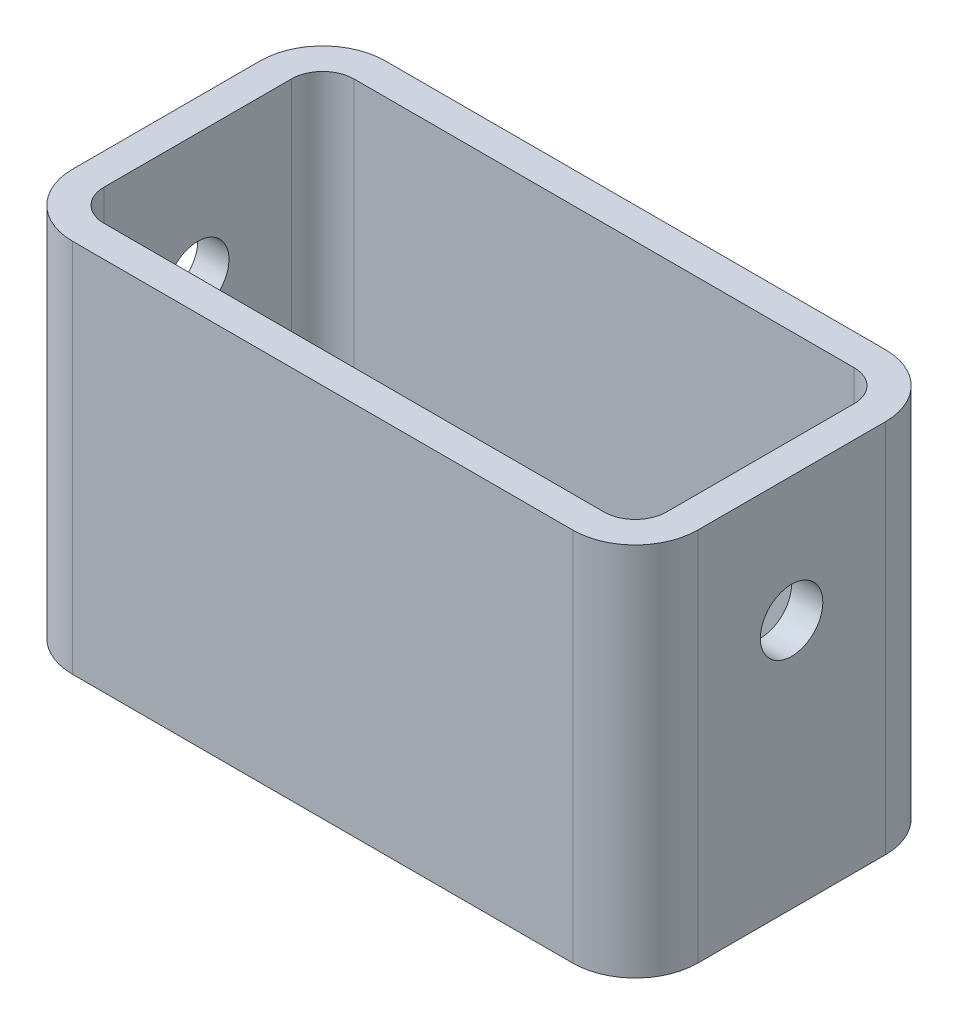
ISO-10303-21;
HEADER;
FILE_DESCRIPTION(('STEP AP214'),'2;1');
FILE_NAME('part.step','',(''),(''),'','','');
FILE_SCHEMA(('AUTOMOTIVE_DESIGN { 1 0 10303 214 1 1 1 1 }'));
ENDSEC;
DATA;
#1=APPLICATION_CONTEXT('core data for automotive mechanical design processes');
#2=APPLICATION_PROTOCOL_DEFINITION('international standard','automotive_design',2000,#1);
#3=PRODUCT_CONTEXT('',#1,'mechanical');
#4=PRODUCT('Part','Part','',(#3));
#5=PRODUCT_RELATED_PRODUCT_CATEGORY('part','',(#4));
#6=PRODUCT_DEFINITION_FORMATION('','',#4);
#7=PRODUCT_DEFINITION_CONTEXT('part definition',#1,'design');
#8=PRODUCT_DEFINITION('design','',#6,#7);
#9=PRODUCT_DEFINITION_SHAPE('','',#8);
#10=(LENGTH_UNIT() NAMED_UNIT(*) SI_UNIT(.MILLI.,.METRE.));
#11=(NAMED_UNIT(*) PLANE_ANGLE_UNIT() SI_UNIT($,.RADIAN.));
#12=(NAMED_UNIT(*) SI_UNIT($,.STERADIAN.) SOLID_ANGLE_UNIT());
#13=UNCERTAINTY_MEASURE_WITH_UNIT(LENGTH_MEASURE(1.E-05),#10,'distance_accuracy_value','');
#14=(GEOMETRIC_REPRESENTATION_CONTEXT(3) GLOBAL_UNCERTAINTY_ASSIGNED_CONTEXT((#13)) GLOBAL_UNIT_ASSIGNED_CONTEXT((#10,
#11,#12)) REPRESENTATION_CONTEXT('',''));
#15=CARTESIAN_POINT('',(0.,0.,0.));
#16=DIRECTION('',(0.,0.,1.));
#17=DIRECTION('',(1.,0.,0.));
#18=AXIS2_PLACEMENT_3D('',#15,#16,#17);
#19=CARTESIAN_POINT('',(0.,0.,50.));
#20=DIRECTION('',(0.,-1.,0.));
#21=DIRECTION('',(0.,0.,-1.));
#22=AXIS2_PLACEMENT_3D('',#19,#20,#21);
#23=PLANE('',#22);
#24=DIRECTION('',(0.,0.,-1.));
#25=VECTOR('',#24,1.);
#26=CARTESIAN_POINT('',(0.,0.,50.));
#27=LINE('',#26,#25);
#28=CARTESIAN_POINT('',(0.,0.,40.));
#29=VERTEX_POINT('',#28);
#30=CARTESIAN_POINT('',(0.,0.,10.));
#31=VERTEX_POINT('',#30);
#32=EDGE_CURVE('E227',#29,#31,#27,.T.);
#33=ORIENTED_EDGE('',*,*,#32,.F.);
#34=CARTESIAN_POINT('',(10.,0.,40.));
#35=DIRECTION('',(0.,-1.,0.));
#36=DIRECTION('',(0.,0.,-1.));
#37=AXIS2_PLACEMENT_3D('',#34,#35,#36);
#38=CIRCLE('',#37,10.);
#39=CARTESIAN_POINT('',(10.,0.,50.));
#40=VERTEX_POINT('',#39);
#41=EDGE_CURVE('E267',#29,#40,#38,.F.);
#42=ORIENTED_EDGE('',*,*,#41,.T.);
#43=DIRECTION('',(-1.,0.,0.));
#44=VECTOR('',#43,1.);
#45=CARTESIAN_POINT('',(0.,0.,50.));
#46=LINE('',#45,#44);
#47=CARTESIAN_POINT('',(90.,0.,50.));
#48=VERTEX_POINT('',#47);
#49=EDGE_CURVE('E223',#48,#40,#46,.T.);
#50=ORIENTED_EDGE('',*,*,#49,.F.);
#51=CARTESIAN_POINT('',(90.,0.,40.));
#52=DIRECTION('',(0.,-1.,0.));
#53=DIRECTION('',(0.,0.,-1.));
#54=AXIS2_PLACEMENT_3D('',#51,#52,#53);
#55=CIRCLE('',#54,10.);
#56=CARTESIAN_POINT('',(100.,0.,40.));
#57=VERTEX_POINT('',#56);
#58=EDGE_CURVE('E262',#48,#57,#55,.F.);
#59=ORIENTED_EDGE('',*,*,#58,.T.);
#60=DIRECTION('',(0.,0.,-1.));
#61=VECTOR('',#60,1.);
#62=CARTESIAN_POINT('',(100.,0.,50.));
#63=LINE('',#62,#61);
#64=CARTESIAN_POINT('',(100.,0.,10.));
#65=VERTEX_POINT('',#64);
#66=EDGE_CURVE('E234',#57,#65,#63,.T.);
#67=ORIENTED_EDGE('',*,*,#66,.T.);
#68=CARTESIAN_POINT('',(90.,0.,10.));
#69=DIRECTION('',(0.,-1.,0.));
#70=DIRECTION('',(0.,0.,-1.));
#71=AXIS2_PLACEMENT_3D('',#68,#69,#70);
#72=CIRCLE('',#71,10.);
#73=CARTESIAN_POINT('',(90.,0.,0.));
#74=VERTEX_POINT('',#73);
#75=EDGE_CURVE('E57',#65,#74,#72,.F.);
#76=ORIENTED_EDGE('',*,*,#75,.T.);
#77=DIRECTION('',(-1.,0.,0.));
#78=VECTOR('',#77,1.);
#79=CARTESIAN_POINT('',(0.,0.,0.));
#80=LINE('',#79,#78);
#81=CARTESIAN_POINT('',(10.,0.,0.));
#82=VERTEX_POINT('',#81);
#83=EDGE_CURVE('E224',#74,#82,#80,.T.);
#84=ORIENTED_EDGE('',*,*,#83,.T.);
#85=CARTESIAN_POINT('',(10.,0.,10.));
#86=DIRECTION('',(0.,-1.,0.));
#87=DIRECTION('',(0.,0.,-1.));
#88=AXIS2_PLACEMENT_3D('',#85,#86,#87);
#89=CIRCLE('',#88,10.);
#90=EDGE_CURVE('E265',#82,#31,#89,.F.);
#91=ORIENTED_EDGE('',*,*,#90,.T.);
#92=EDGE_LOOP('',(#33,#42,#50,#59,#67,#76,#84,#91));
#93=FACE_BOUND('',#92,.T.);
#94=CARTESIAN_POINT('',(10.,0.,40.));
#95=DIRECTION('',(0.,-1.,0.));
#96=DIRECTION('',(0.,0.,-1.));
#97=AXIS2_PLACEMENT_3D('',#94,#95,#96);
#98=CIRCLE('',#97,5.);
#99=CARTESIAN_POINT('',(5.,0.,40.));
#100=VERTEX_POINT('',#99);
#101=CARTESIAN_POINT('',(10.,0.,45.));
#102=VERTEX_POINT('',#101);
#103=EDGE_CURVE('E206',#100,#102,#98,.F.);
#104=ORIENTED_EDGE('',*,*,#103,.F.);
#105=DIRECTION('',(0.,0.,-1.));
#106=VECTOR('',#105,1.);
#107=CARTESIAN_POINT('',(5.,0.,50.));
#108=LINE('',#107,#106);
#109=CARTESIAN_POINT('',(5.,0.,10.));
#110=VERTEX_POINT('',#109);
#111=EDGE_CURVE('E174',#100,#110,#108,.T.);
#112=ORIENTED_EDGE('',*,*,#111,.T.);
#113=CARTESIAN_POINT('',(10.,0.,10.));
#114=DIRECTION('',(0.,-1.,0.));
#115=DIRECTION('',(0.,0.,-1.));
#116=AXIS2_PLACEMENT_3D('',#113,#114,#115);
#117=CIRCLE('',#116,5.);
#118=CARTESIAN_POINT('',(10.,0.,5.));
#119=VERTEX_POINT('',#118);
#120=EDGE_CURVE('E212',#119,#110,#117,.F.);
#121=ORIENTED_EDGE('',*,*,#120,.F.);
#122=DIRECTION('',(-1.,0.,0.));
#123=VECTOR('',#122,1.);
#124=CARTESIAN_POINT('',(0.,0.,5.));
#125=LINE('',#124,#123);
#126=CARTESIAN_POINT('',(90.,0.,5.));
#127=VERTEX_POINT('',#126);
#128=EDGE_CURVE('E49',#127,#119,#125,.T.);
#129=ORIENTED_EDGE('',*,*,#128,.F.);
#130=CARTESIAN_POINT('',(90.,0.,10.));
#131=DIRECTION('',(0.,-1.,0.));
#132=DIRECTION('',(0.,0.,-1.));
#133=AXIS2_PLACEMENT_3D('',#130,#131,#132);
#134=CIRCLE('',#133,5.);
#135=CARTESIAN_POINT('',(95.,0.,10.));
#136=VERTEX_POINT('',#135);
#137=EDGE_CURVE('E178',#136,#127,#134,.F.);
#138=ORIENTED_EDGE('',*,*,#137,.F.);
#139=DIRECTION('',(0.,0.,-1.));
#140=VECTOR('',#139,1.);
#141=CARTESIAN_POINT('',(95.,0.,50.));
#142=LINE('',#141,#140);
#143=CARTESIAN_POINT('',(95.,0.,40.));
#144=VERTEX_POINT('',#143);
#145=EDGE_CURVE('E196',#144,#136,#142,.T.);
#146=ORIENTED_EDGE('',*,*,#145,.F.);
#147=CARTESIAN_POINT('',(90.,0.,40.));
#148=DIRECTION('',(0.,-1.,0.));
#149=DIRECTION('',(0.,0.,-1.));
#150=AXIS2_PLACEMENT_3D('',#147,#148,#149);
#151=CIRCLE('',#150,5.);
#152=CARTESIAN_POINT('',(90.,0.,45.));
#153=VERTEX_POINT('',#152);
#154=EDGE_CURVE('E176',#153,#144,#151,.F.);
#155=ORIENTED_EDGE('',*,*,#154,.F.);
#156=DIRECTION('',(-1.,0.,0.));
#157=VECTOR('',#156,1.);
#158=CARTESIAN_POINT('',(0.,0.,45.));
#159=LINE('',#158,#157);
#160=EDGE_CURVE('E184',#153,#102,#159,.T.);
#161=ORIENTED_EDGE('',*,*,#160,.T.);
#162=EDGE_LOOP('',(#104,#112,#121,#129,#138,#146,#155,#161));
#163=FACE_BOUND('',#162,.T.);
#164=ADVANCED_FACE('F33',(#93,#163),#23,.F.);
#165=CARTESIAN_POINT('',(0.,0.,50.));
#166=DIRECTION('',(1.,0.,0.));
#167=DIRECTION('',(0.,1.,0.));
#168=AXIS2_PLACEMENT_3D('',#165,#166,#167);
#169=PLANE('',#168);
#170=CARTESIAN_POINT('',(0.,-20.,25.));
#171=DIRECTION('',(1.,0.,0.));
#172=DIRECTION('',(0.,1.,0.));
#173=AXIS2_PLACEMENT_3D('',#170,#171,#172);
#174=CIRCLE('',#173,5.);
#175=CARTESIAN_POINT('',(0.,-15.,25.));
#176=VERTEX_POINT('',#175);
#177=EDGE_CURVE('E384',#176,#176,#174,.T.);
#178=ORIENTED_EDGE('',*,*,#177,.T.);
#179=EDGE_LOOP('',(#178));
#180=FACE_BOUND('',#179,.T.);
#181=DIRECTION('',(0.,0.,-1.));
#182=VECTOR('',#181,1.);
#183=CARTESIAN_POINT('',(0.,-60.,50.));
#184=LINE('',#183,#182);
#185=CARTESIAN_POINT('',(0.,-60.,40.));
#186=VERTEX_POINT('',#185);
#187=CARTESIAN_POINT('',(0.,-60.,10.));
#188=VERTEX_POINT('',#187);
#189=EDGE_CURVE('E240',#186,#188,#184,.T.);
#190=ORIENTED_EDGE('',*,*,#189,.F.);
#191=DIRECTION('',(0.,-1.,0.));
#192=VECTOR('',#191,1.);
#193=CARTESIAN_POINT('',(0.,0.,40.));
#194=LINE('',#193,#192);
#195=EDGE_CURVE('E260',#186,#29,#194,.F.);
#196=ORIENTED_EDGE('',*,*,#195,.T.);
#197=ORIENTED_EDGE('',*,*,#32,.T.);
#198=DIRECTION('',(0.,-1.,0.));
#199=VECTOR('',#198,1.);
#200=CARTESIAN_POINT('',(0.,0.,10.));
#201=LINE('',#200,#199);
#202=EDGE_CURVE('E257',#31,#188,#201,.T.);
#203=ORIENTED_EDGE('',*,*,#202,.T.);
#204=EDGE_LOOP('',(#190,#196,#197,#203));
#205=FACE_BOUND('',#204,.T.);
#206=ADVANCED_FACE('F298',(#180,#205),#169,.F.);
#207=CARTESIAN_POINT('',(0.,-60.,50.));
#208=DIRECTION('',(0.,1.,0.));
#209=DIRECTION('',(0.,0.,1.));
#210=AXIS2_PLACEMENT_3D('',#207,#208,#209);
#211=PLANE('',#210);
#212=DIRECTION('',(1.,0.,0.));
#213=VECTOR('',#212,1.);
#214=CARTESIAN_POINT('',(0.,-60.,50.));
#215=LINE('',#214,#213);
#216=CARTESIAN_POINT('',(10.,-60.,50.));
#217=VERTEX_POINT('',#216);
#218=CARTESIAN_POINT('',(90.,-60.,50.));
#219=VERTEX_POINT('',#218);
#220=EDGE_CURVE('E220',#217,#219,#215,.T.);
#221=ORIENTED_EDGE('',*,*,#220,.F.);
#222=CARTESIAN_POINT('',(10.,-60.,40.));
#223=DIRECTION('',(0.,1.,0.));
#224=DIRECTION('',(0.,0.,1.));
#225=AXIS2_PLACEMENT_3D('',#222,#223,#224);
#226=CIRCLE('',#225,10.);
#227=EDGE_CURVE('E255',#217,#186,#226,.F.);
#228=ORIENTED_EDGE('',*,*,#227,.T.);
#229=ORIENTED_EDGE('',*,*,#189,.T.);
#230=CARTESIAN_POINT('',(10.,-60.,10.));
#231=DIRECTION('',(0.,1.,0.));
#232=DIRECTION('',(0.,0.,1.));
#233=AXIS2_PLACEMENT_3D('',#230,#231,#232);
#234=CIRCLE('',#233,10.);
#235=CARTESIAN_POINT('',(10.,-60.,0.));
#236=VERTEX_POINT('',#235);
#237=EDGE_CURVE('E253',#188,#236,#234,.F.);
#238=ORIENTED_EDGE('',*,*,#237,.T.);
#239=DIRECTION('',(1.,0.,0.));
#240=VECTOR('',#239,1.);
#241=CARTESIAN_POINT('',(0.,-60.,0.));
#242=LINE('',#241,#240);
#243=CARTESIAN_POINT('',(90.,-60.,0.));
#244=VERTEX_POINT('',#243);
#245=EDGE_CURVE('E200',#236,#244,#242,.T.);
#246=ORIENTED_EDGE('',*,*,#245,.T.);
#247=CARTESIAN_POINT('',(90.,-60.,10.));
#248=DIRECTION('',(0.,1.,0.));
#249=DIRECTION('',(0.,0.,1.));
#250=AXIS2_PLACEMENT_3D('',#247,#248,#249);
#251=CIRCLE('',#250,10.);
#252=CARTESIAN_POINT('',(100.,-60.,10.));
#253=VERTEX_POINT('',#252);
#254=EDGE_CURVE('E251',#244,#253,#251,.F.);
#255=ORIENTED_EDGE('',*,*,#254,.T.);
#256=DIRECTION('',(0.,0.,-1.));
#257=VECTOR('',#256,1.);
#258=CARTESIAN_POINT('',(100.,-60.,50.));
#259=LINE('',#258,#257);
#260=CARTESIAN_POINT('',(100.,-60.,40.));
#261=VERTEX_POINT('',#260);
#262=EDGE_CURVE('E237',#261,#253,#259,.T.);
#263=ORIENTED_EDGE('',*,*,#262,.F.);
#264=CARTESIAN_POINT('',(90.,-60.,40.));
#265=DIRECTION('',(0.,1.,0.));
#266=DIRECTION('',(0.,0.,1.));
#267=AXIS2_PLACEMENT_3D('',#264,#265,#266);
#268=CIRCLE('',#267,10.);
#269=EDGE_CURVE('E249',#261,#219,#268,.F.);
#270=ORIENTED_EDGE('',*,*,#269,.T.);
#271=EDGE_LOOP('',(#221,#228,#229,#238,#246,#255,#263,#270));
#272=FACE_BOUND('',#271,.T.);
#273=ADVANCED_FACE('F282',(#272),#211,.F.);
#274=CARTESIAN_POINT('',(100.,0.,50.));
#275=DIRECTION('',(-1.,0.,0.));
#276=DIRECTION('',(0.,-1.,0.));
#277=AXIS2_PLACEMENT_3D('',#274,#275,#276);
#278=PLANE('',#277);
#279=CARTESIAN_POINT('',(100.,-20.,25.));
#280=DIRECTION('',(1.,0.,0.));
#281=DIRECTION('',(0.,1.,0.));
#282=AXIS2_PLACEMENT_3D('',#279,#280,#281);
#283=CIRCLE('',#282,5.);
#284=CARTESIAN_POINT('',(100.,-15.,25.));
#285=VERTEX_POINT('',#284);
#286=EDGE_CURVE('E383',#285,#285,#283,.T.);
#287=ORIENTED_EDGE('',*,*,#286,.F.);
#288=EDGE_LOOP('',(#287));
#289=FACE_BOUND('',#288,.T.);
#290=ORIENTED_EDGE('',*,*,#262,.T.);
#291=DIRECTION('',(0.,1.,0.));
#292=VECTOR('',#291,1.);
#293=CARTESIAN_POINT('',(100.,0.,10.));
#294=LINE('',#293,#292);
#295=EDGE_CURVE('E11',#253,#65,#294,.T.);
#296=ORIENTED_EDGE('',*,*,#295,.T.);
#297=ORIENTED_EDGE('',*,*,#66,.F.);
#298=DIRECTION('',(0.,1.,0.));
#299=VECTOR('',#298,1.);
#300=CARTESIAN_POINT('',(100.,-60.,40.));
#301=LINE('',#300,#299);
#302=EDGE_CURVE('E42',#57,#261,#301,.F.);
#303=ORIENTED_EDGE('',*,*,#302,.T.);
#304=EDGE_LOOP('',(#290,#296,#297,#303));
#305=FACE_BOUND('',#304,.T.);
#306=ADVANCED_FACE('F277',(#289,#305),#278,.F.);
#307=CARTESIAN_POINT('',(0.,0.,50.));
#308=DIRECTION('',(0.,0.,1.));
#309=DIRECTION('',(1.,0.,0.));
#310=AXIS2_PLACEMENT_3D('',#307,#308,#309);
#311=PLANE('',#310);
#312=ORIENTED_EDGE('',*,*,#49,.T.);
#313=DIRECTION('',(0.,-1.,0.));
#314=VECTOR('',#313,1.);
#315=CARTESIAN_POINT('',(10.,-60.,50.));
#316=LINE('',#315,#314);
#317=EDGE_CURVE('E246',#40,#217,#316,.T.);
#318=ORIENTED_EDGE('',*,*,#317,.T.);
#319=ORIENTED_EDGE('',*,*,#220,.T.);
#320=DIRECTION('',(0.,1.,0.));
#321=VECTOR('',#320,1.);
#322=CARTESIAN_POINT('',(90.,0.,50.));
#323=LINE('',#322,#321);
#324=EDGE_CURVE('E243',#219,#48,#323,.T.);
#325=ORIENTED_EDGE('',*,*,#324,.T.);
#326=EDGE_LOOP('',(#312,#318,#319,#325));
#327=FACE_BOUND('',#326,.T.);
#328=ADVANCED_FACE('F287',(#327),#311,.T.);
#329=CARTESIAN_POINT('',(0.,0.,0.));
#330=DIRECTION('',(0.,0.,1.));
#331=DIRECTION('',(1.,0.,0.));
#332=AXIS2_PLACEMENT_3D('',#329,#330,#331);
#333=PLANE('',#332);
#334=ORIENTED_EDGE('',*,*,#245,.F.);
#335=DIRECTION('',(0.,-1.,0.));
#336=VECTOR('',#335,1.);
#337=CARTESIAN_POINT('',(10.,0.,0.));
#338=LINE('',#337,#336);
#339=EDGE_CURVE('E271',#236,#82,#338,.F.);
#340=ORIENTED_EDGE('',*,*,#339,.T.);
#341=ORIENTED_EDGE('',*,*,#83,.F.);
#342=DIRECTION('',(0.,1.,0.));
#343=VECTOR('',#342,1.);
#344=CARTESIAN_POINT('',(90.,0.,0.));
#345=LINE('',#344,#343);
#346=EDGE_CURVE('E269',#74,#244,#345,.F.);
#347=ORIENTED_EDGE('',*,*,#346,.T.);
#348=EDGE_LOOP('',(#334,#340,#341,#347));
#349=FACE_BOUND('',#348,.T.);
#350=ADVANCED_FACE('F306',(#349),#333,.F.);
#351=CARTESIAN_POINT('',(10.,0.,40.));
#352=DIRECTION('',(0.,1.,0.));
#353=DIRECTION('',(-1.,0.,0.));
#354=AXIS2_PLACEMENT_3D('',#351,#352,#353);
#355=CYLINDRICAL_SURFACE('',#354,10.);
#356=ORIENTED_EDGE('',*,*,#41,.F.);
#357=ORIENTED_EDGE('',*,*,#195,.F.);
#358=ORIENTED_EDGE('',*,*,#227,.F.);
#359=ORIENTED_EDGE('',*,*,#317,.F.);
#360=EDGE_LOOP('',(#356,#357,#358,#359));
#361=FACE_BOUND('',#360,.T.);
#362=ADVANCED_FACE('F295',(#361),#355,.T.);
#363=CARTESIAN_POINT('',(10.,0.,10.));
#364=DIRECTION('',(0.,-1.,0.));
#365=DIRECTION('',(1.,0.,0.));
#366=AXIS2_PLACEMENT_3D('',#363,#364,#365);
#367=CYLINDRICAL_SURFACE('',#366,10.);
#368=ORIENTED_EDGE('',*,*,#90,.F.);
#369=ORIENTED_EDGE('',*,*,#339,.F.);
#370=ORIENTED_EDGE('',*,*,#237,.F.);
#371=ORIENTED_EDGE('',*,*,#202,.F.);
#372=EDGE_LOOP('',(#368,#369,#370,#371));
#373=FACE_BOUND('',#372,.T.);
#374=ADVANCED_FACE('F302',(#373),#367,.T.);
#375=CARTESIAN_POINT('',(90.,0.,10.));
#376=DIRECTION('',(0.,1.,0.));
#377=DIRECTION('',(-1.,0.,0.));
#378=AXIS2_PLACEMENT_3D('',#375,#376,#377);
#379=CYLINDRICAL_SURFACE('',#378,10.);
#380=ORIENTED_EDGE('',*,*,#254,.F.);
#381=ORIENTED_EDGE('',*,*,#346,.F.);
#382=ORIENTED_EDGE('',*,*,#75,.F.);
#383=ORIENTED_EDGE('',*,*,#295,.F.);
#384=EDGE_LOOP('',(#380,#381,#382,#383));
#385=FACE_BOUND('',#384,.T.);
#386=ADVANCED_FACE('F308',(#385),#379,.T.);
#387=CARTESIAN_POINT('',(90.,0.,40.));
#388=DIRECTION('',(0.,-1.,0.));
#389=DIRECTION('',(1.,0.,0.));
#390=AXIS2_PLACEMENT_3D('',#387,#388,#389);
#391=CYLINDRICAL_SURFACE('',#390,10.);
#392=ORIENTED_EDGE('',*,*,#269,.F.);
#393=ORIENTED_EDGE('',*,*,#302,.F.);
#394=ORIENTED_EDGE('',*,*,#58,.F.);
#395=ORIENTED_EDGE('',*,*,#324,.F.);
#396=EDGE_LOOP('',(#392,#393,#394,#395));
#397=FACE_BOUND('',#396,.T.);
#398=ADVANCED_FACE('F35',(#397),#391,.T.);
#399=CARTESIAN_POINT('',(5.,0.,50.));
#400=DIRECTION('',(1.,0.,0.));
#401=DIRECTION('',(0.,1.,0.));
#402=AXIS2_PLACEMENT_3D('',#399,#400,#401);
#403=PLANE('',#402);
#404=CARTESIAN_POINT('',(5.,-20.,25.));
#405=DIRECTION('',(1.,0.,0.));
#406=DIRECTION('',(0.,1.,0.));
#407=AXIS2_PLACEMENT_3D('',#404,#405,#406);
#408=CIRCLE('',#407,5.);
#409=CARTESIAN_POINT('',(5.,-15.,25.));
#410=VERTEX_POINT('',#409);
#411=EDGE_CURVE('E191',#410,#410,#408,.T.);
#412=ORIENTED_EDGE('',*,*,#411,.F.);
#413=EDGE_LOOP('',(#412));
#414=FACE_BOUND('',#413,.T.);
#415=DIRECTION('',(0.,0.,-1.));
#416=VECTOR('',#415,1.);
#417=CARTESIAN_POINT('',(5.00000000000001,-55.,50.));
#418=LINE('',#417,#416);
#419=CARTESIAN_POINT('',(5.00000000000001,-55.,40.));
#420=VERTEX_POINT('',#419);
#421=CARTESIAN_POINT('',(5.00000000000001,-55.,10.));
#422=VERTEX_POINT('',#421);
#423=EDGE_CURVE('E163',#420,#422,#418,.T.);
#424=ORIENTED_EDGE('',*,*,#423,.T.);
#425=DIRECTION('',(0.,1.,0.));
#426=VECTOR('',#425,1.);
#427=CARTESIAN_POINT('',(5.,0.,10.));
#428=LINE('',#427,#426);
#429=EDGE_CURVE('E159',#110,#422,#428,.F.);
#430=ORIENTED_EDGE('',*,*,#429,.F.);
#431=ORIENTED_EDGE('',*,*,#111,.F.);
#432=DIRECTION('',(0.,1.,0.));
#433=VECTOR('',#432,1.);
#434=CARTESIAN_POINT('',(5.,0.,40.));
#435=LINE('',#434,#433);
#436=EDGE_CURVE('E152',#420,#100,#435,.T.);
#437=ORIENTED_EDGE('',*,*,#436,.F.);
#438=EDGE_LOOP('',(#424,#430,#431,#437));
#439=FACE_BOUND('',#438,.T.);
#440=ADVANCED_FACE('F172',(#414,#439),#403,.T.);
#441=CARTESIAN_POINT('',(0.,-55.,50.));
#442=DIRECTION('',(0.,1.,0.));
#443=DIRECTION('',(0.,0.,1.));
#444=AXIS2_PLACEMENT_3D('',#441,#442,#443);
#445=PLANE('',#444);
#446=DIRECTION('',(1.,0.,0.));
#447=VECTOR('',#446,1.);
#448=CARTESIAN_POINT('',(0.,-55.,45.));
#449=LINE('',#448,#447);
#450=CARTESIAN_POINT('',(10.,-55.,45.));
#451=VERTEX_POINT('',#450);
#452=CARTESIAN_POINT('',(90.,-55.,45.));
#453=VERTEX_POINT('',#452);
#454=EDGE_CURVE('E183',#451,#453,#449,.T.);
#455=ORIENTED_EDGE('',*,*,#454,.T.);
#456=CARTESIAN_POINT('',(90.,-55.,40.));
#457=DIRECTION('',(0.,1.,0.));
#458=DIRECTION('',(0.,0.,1.));
#459=AXIS2_PLACEMENT_3D('',#456,#457,#458);
#460=CIRCLE('',#459,5.);
#461=CARTESIAN_POINT('',(95.,-55.,40.));
#462=VERTEX_POINT('',#461);
#463=EDGE_CURVE('E193',#462,#453,#460,.F.);
#464=ORIENTED_EDGE('',*,*,#463,.F.);
#465=DIRECTION('',(0.,0.,-1.));
#466=VECTOR('',#465,1.);
#467=CARTESIAN_POINT('',(95.,-55.,50.));
#468=LINE('',#467,#466);
#469=CARTESIAN_POINT('',(95.,-55.,10.));
#470=VERTEX_POINT('',#469);
#471=EDGE_CURVE('E170',#462,#470,#468,.T.);
#472=ORIENTED_EDGE('',*,*,#471,.T.);
#473=CARTESIAN_POINT('',(90.,-55.,10.));
#474=DIRECTION('',(0.,1.,0.));
#475=DIRECTION('',(0.,0.,1.));
#476=AXIS2_PLACEMENT_3D('',#473,#474,#475);
#477=CIRCLE('',#476,5.);
#478=CARTESIAN_POINT('',(90.,-55.,5.));
#479=VERTEX_POINT('',#478);
#480=EDGE_CURVE('E187',#479,#470,#477,.F.);
#481=ORIENTED_EDGE('',*,*,#480,.F.);
#482=DIRECTION('',(1.,0.,0.));
#483=VECTOR('',#482,1.);
#484=CARTESIAN_POINT('',(0.,-55.,5.));
#485=LINE('',#484,#483);
#486=CARTESIAN_POINT('',(10.,-55.,5.));
#487=VERTEX_POINT('',#486);
#488=EDGE_CURVE('E188',#487,#479,#485,.T.);
#489=ORIENTED_EDGE('',*,*,#488,.F.);
#490=CARTESIAN_POINT('',(10.,-55.,10.));
#491=DIRECTION('',(0.,1.,0.));
#492=DIRECTION('',(0.,0.,1.));
#493=AXIS2_PLACEMENT_3D('',#490,#491,#492);
#494=CIRCLE('',#493,5.);
#495=EDGE_CURVE('E160',#422,#487,#494,.F.);
#496=ORIENTED_EDGE('',*,*,#495,.F.);
#497=ORIENTED_EDGE('',*,*,#423,.F.);
#498=CARTESIAN_POINT('',(10.,-55.,40.));
#499=DIRECTION('',(0.,1.,0.));
#500=DIRECTION('',(0.,0.,1.));
#501=AXIS2_PLACEMENT_3D('',#498,#499,#500);
#502=CIRCLE('',#501,5.);
#503=EDGE_CURVE('E148',#451,#420,#502,.F.);
#504=ORIENTED_EDGE('',*,*,#503,.F.);
#505=EDGE_LOOP('',(#455,#464,#472,#481,#489,#496,#497,#504));
#506=FACE_BOUND('',#505,.T.);
#507=ADVANCED_FACE('F164',(#506),#445,.T.);
#508=CARTESIAN_POINT('',(95.,0.,50.));
#509=DIRECTION('',(-1.,0.,0.));
#510=DIRECTION('',(0.,-1.,0.));
#511=AXIS2_PLACEMENT_3D('',#508,#509,#510);
#512=PLANE('',#511);
#513=CARTESIAN_POINT('',(95.,-20.,25.));
#514=DIRECTION('',(-1.,0.,0.));
#515=DIRECTION('',(0.,-1.,0.));
#516=AXIS2_PLACEMENT_3D('',#513,#514,#515);
#517=CIRCLE('',#516,5.);
#518=CARTESIAN_POINT('',(95.,-15.,25.));
#519=VERTEX_POINT('',#518);
#520=EDGE_CURVE('E37',#519,#519,#517,.T.);
#521=ORIENTED_EDGE('',*,*,#520,.F.);
#522=EDGE_LOOP('',(#521));
#523=FACE_BOUND('',#522,.T.);
#524=ORIENTED_EDGE('',*,*,#471,.F.);
#525=DIRECTION('',(0.,-1.,0.));
#526=VECTOR('',#525,1.);
#527=CARTESIAN_POINT('',(95.,0.,40.));
#528=LINE('',#527,#526);
#529=EDGE_CURVE('E201',#144,#462,#528,.T.);
#530=ORIENTED_EDGE('',*,*,#529,.F.);
#531=ORIENTED_EDGE('',*,*,#145,.T.);
#532=DIRECTION('',(0.,-1.,0.));
#533=VECTOR('',#532,1.);
#534=CARTESIAN_POINT('',(95.,0.,10.));
#535=LINE('',#534,#533);
#536=EDGE_CURVE('E198',#470,#136,#535,.F.);
#537=ORIENTED_EDGE('',*,*,#536,.F.);
#538=EDGE_LOOP('',(#524,#530,#531,#537));
#539=FACE_BOUND('',#538,.T.);
#540=ADVANCED_FACE('F361',(#523,#539),#512,.T.);
#541=CARTESIAN_POINT('',(0.,0.,45.));
#542=DIRECTION('',(0.,0.,1.));
#543=DIRECTION('',(1.,0.,0.));
#544=AXIS2_PLACEMENT_3D('',#541,#542,#543);
#545=PLANE('',#544);
#546=ORIENTED_EDGE('',*,*,#160,.F.);
#547=DIRECTION('',(0.,1.,0.));
#548=VECTOR('',#547,1.);
#549=CARTESIAN_POINT('',(90.,0.,45.));
#550=LINE('',#549,#548);
#551=EDGE_CURVE('E169',#453,#153,#550,.T.);
#552=ORIENTED_EDGE('',*,*,#551,.F.);
#553=ORIENTED_EDGE('',*,*,#454,.F.);
#554=DIRECTION('',(0.,1.,0.));
#555=VECTOR('',#554,1.);
#556=CARTESIAN_POINT('',(10.,0.,45.));
#557=LINE('',#556,#555);
#558=EDGE_CURVE('E155',#102,#451,#557,.F.);
#559=ORIENTED_EDGE('',*,*,#558,.F.);
#560=EDGE_LOOP('',(#546,#552,#553,#559));
#561=FACE_BOUND('',#560,.T.);
#562=ADVANCED_FACE('F358',(#561),#545,.F.);
#563=CARTESIAN_POINT('',(0.,0.,5.));
#564=DIRECTION('',(0.,0.,1.));
#565=DIRECTION('',(1.,0.,0.));
#566=AXIS2_PLACEMENT_3D('',#563,#564,#565);
#567=PLANE('',#566);
#568=ORIENTED_EDGE('',*,*,#488,.T.);
#569=DIRECTION('',(0.,1.,0.));
#570=VECTOR('',#569,1.);
#571=CARTESIAN_POINT('',(90.,0.,5.));
#572=LINE('',#571,#570);
#573=EDGE_CURVE('E204',#127,#479,#572,.F.);
#574=ORIENTED_EDGE('',*,*,#573,.F.);
#575=ORIENTED_EDGE('',*,*,#128,.T.);
#576=DIRECTION('',(0.,1.,0.));
#577=VECTOR('',#576,1.);
#578=CARTESIAN_POINT('',(10.,0.,5.));
#579=LINE('',#578,#577);
#580=EDGE_CURVE('E203',#487,#119,#579,.T.);
#581=ORIENTED_EDGE('',*,*,#580,.F.);
#582=EDGE_LOOP('',(#568,#574,#575,#581));
#583=FACE_BOUND('',#582,.T.);
#584=ADVANCED_FACE('F355',(#583),#567,.T.);
#585=CARTESIAN_POINT('',(10.,0.,40.));
#586=DIRECTION('',(0.,1.,0.));
#587=DIRECTION('',(-1.,0.,0.));
#588=AXIS2_PLACEMENT_3D('',#585,#586,#587);
#589=CYLINDRICAL_SURFACE('',#588,5.);
#590=ORIENTED_EDGE('',*,*,#103,.T.);
#591=ORIENTED_EDGE('',*,*,#558,.T.);
#592=ORIENTED_EDGE('',*,*,#503,.T.);
#593=ORIENTED_EDGE('',*,*,#436,.T.);
#594=EDGE_LOOP('',(#590,#591,#592,#593));
#595=FACE_BOUND('',#594,.T.);
#596=ADVANCED_FACE('F150',(#595),#589,.F.);
#597=CARTESIAN_POINT('',(10.,0.,10.));
#598=DIRECTION('',(0.,-1.,0.));
#599=DIRECTION('',(1.,0.,0.));
#600=AXIS2_PLACEMENT_3D('',#597,#598,#599);
#601=CYLINDRICAL_SURFACE('',#600,5.);
#602=ORIENTED_EDGE('',*,*,#120,.T.);
#603=ORIENTED_EDGE('',*,*,#429,.T.);
#604=ORIENTED_EDGE('',*,*,#495,.T.);
#605=ORIENTED_EDGE('',*,*,#580,.T.);
#606=EDGE_LOOP('',(#602,#603,#604,#605));
#607=FACE_BOUND('',#606,.T.);
#608=ADVANCED_FACE('F348',(#607),#601,.F.);
#609=CARTESIAN_POINT('',(90.,0.,10.));
#610=DIRECTION('',(0.,1.,0.));
#611=DIRECTION('',(-1.,0.,0.));
#612=AXIS2_PLACEMENT_3D('',#609,#610,#611);
#613=CYLINDRICAL_SURFACE('',#612,5.);
#614=ORIENTED_EDGE('',*,*,#480,.T.);
#615=ORIENTED_EDGE('',*,*,#536,.T.);
#616=ORIENTED_EDGE('',*,*,#137,.T.);
#617=ORIENTED_EDGE('',*,*,#573,.T.);
#618=EDGE_LOOP('',(#614,#615,#616,#617));
#619=FACE_BOUND('',#618,.T.);
#620=ADVANCED_FACE('F344',(#619),#613,.F.);
#621=CARTESIAN_POINT('',(90.,0.,40.));
#622=DIRECTION('',(0.,-1.,0.));
#623=DIRECTION('',(1.,0.,0.));
#624=AXIS2_PLACEMENT_3D('',#621,#622,#623);
#625=CYLINDRICAL_SURFACE('',#624,5.);
#626=ORIENTED_EDGE('',*,*,#463,.T.);
#627=ORIENTED_EDGE('',*,*,#551,.T.);
#628=ORIENTED_EDGE('',*,*,#154,.T.);
#629=ORIENTED_EDGE('',*,*,#529,.T.);
#630=EDGE_LOOP('',(#626,#627,#628,#629));
#631=FACE_BOUND('',#630,.T.);
#632=ADVANCED_FACE('F340',(#631),#625,.F.);
#633=CARTESIAN_POINT('',(0.,-20.,25.));
#634=DIRECTION('',(1.,0.,0.));
#635=DIRECTION('',(0.,1.,0.));
#636=AXIS2_PLACEMENT_3D('',#633,#634,#635);
#637=CYLINDRICAL_SURFACE('',#636,5.);
#638=CARTESIAN_POINT('',(95.,-15.,25.));
#639=CARTESIAN_POINT('',(95.0520833333333,-15.,25.));
#640=CARTESIAN_POINT('',(95.1041666666667,-15.,25.));
#641=CARTESIAN_POINT('',(95.2083333333333,-15.,25.));
#642=CARTESIAN_POINT('',(95.2604166666667,-15.,25.));
#643=CARTESIAN_POINT('',(95.3645833333333,-15.,25.));
#644=CARTESIAN_POINT('',(95.4166666666667,-15.,25.));
#645=CARTESIAN_POINT('',(95.5208333333333,-15.,25.));
#646=CARTESIAN_POINT('',(95.5729166666667,-15.,25.));
#647=CARTESIAN_POINT('',(95.6770833333333,-15.,25.));
#648=CARTESIAN_POINT('',(95.7291666666667,-15.,25.));
#649=CARTESIAN_POINT('',(95.8333333333334,-15.,25.));
#650=CARTESIAN_POINT('',(95.8854166666667,-15.,25.));
#651=CARTESIAN_POINT('',(95.9895833333334,-15.,25.));
#652=CARTESIAN_POINT('',(96.0416666666667,-15.,25.));
#653=CARTESIAN_POINT('',(96.1458333333333,-15.,25.));
#654=CARTESIAN_POINT('',(96.1979166666667,-15.,25.));
#655=CARTESIAN_POINT('',(96.3020833333333,-15.,25.));
#656=CARTESIAN_POINT('',(96.3541666666667,-15.,25.));
#657=CARTESIAN_POINT('',(96.4583333333333,-15.,25.));
#658=CARTESIAN_POINT('',(96.5104166666667,-15.,25.));
#659=CARTESIAN_POINT('',(96.6145833333334,-15.,25.));
#660=CARTESIAN_POINT('',(96.6666666666667,-15.,25.));
#661=CARTESIAN_POINT('',(96.7708333333333,-15.,25.));
#662=CARTESIAN_POINT('',(96.8229166666667,-15.,25.));
#663=CARTESIAN_POINT('',(96.9270833333333,-15.,25.));
#664=CARTESIAN_POINT('',(96.9791666666667,-15.,25.));
#665=CARTESIAN_POINT('',(97.0833333333334,-15.,25.));
#666=CARTESIAN_POINT('',(97.1354166666667,-15.,25.));
#667=CARTESIAN_POINT('',(97.2395833333334,-15.,25.));
#668=CARTESIAN_POINT('',(97.2916666666667,-15.,25.));
#669=CARTESIAN_POINT('',(97.3958333333333,-15.,25.));
#670=CARTESIAN_POINT('',(97.4479166666667,-15.,25.));
#671=CARTESIAN_POINT('',(97.5520833333333,-15.,25.));
#672=CARTESIAN_POINT('',(97.6041666666667,-15.,25.));
#673=CARTESIAN_POINT('',(97.7083333333333,-15.,25.));
#674=CARTESIAN_POINT('',(97.7604166666667,-15.,25.));
#675=CARTESIAN_POINT('',(97.8645833333334,-15.,25.));
#676=CARTESIAN_POINT('',(97.9166666666667,-15.,25.));
#677=CARTESIAN_POINT('',(98.0208333333333,-15.,25.));
#678=CARTESIAN_POINT('',(98.0729166666667,-15.,25.));
#679=CARTESIAN_POINT('',(98.1770833333333,-15.,25.));
#680=CARTESIAN_POINT('',(98.2291666666667,-15.,25.));
#681=CARTESIAN_POINT('',(98.3333333333334,-15.,25.));
#682=CARTESIAN_POINT('',(98.3854166666667,-15.,25.));
#683=CARTESIAN_POINT('',(98.4895833333334,-15.,25.));
#684=CARTESIAN_POINT('',(98.5416666666667,-15.,25.));
#685=CARTESIAN_POINT('',(98.6458333333333,-15.,25.));
#686=CARTESIAN_POINT('',(98.6979166666667,-15.,25.));
#687=CARTESIAN_POINT('',(98.8020833333333,-15.,25.));
#688=CARTESIAN_POINT('',(98.8541666666667,-15.,25.));
#689=CARTESIAN_POINT('',(98.9583333333333,-15.,25.));
#690=CARTESIAN_POINT('',(99.0104166666667,-15.,25.));
#691=CARTESIAN_POINT('',(99.1145833333334,-15.,25.));
#692=CARTESIAN_POINT('',(99.1666666666667,-15.,25.));
#693=CARTESIAN_POINT('',(99.2708333333333,-15.,25.));
#694=CARTESIAN_POINT('',(99.3229166666667,-15.,25.));
#695=CARTESIAN_POINT('',(99.4270833333333,-15.,25.));
#696=CARTESIAN_POINT('',(99.4791666666667,-15.,25.));
#697=CARTESIAN_POINT('',(99.5833333333334,-15.,25.));
#698=CARTESIAN_POINT('',(99.6354166666667,-15.,25.));
#699=CARTESIAN_POINT('',(99.7395833333334,-15.,25.));
#700=CARTESIAN_POINT('',(99.7916666666667,-15.,25.));
#701=CARTESIAN_POINT('',(99.8958333333334,-15.,25.));
#702=CARTESIAN_POINT('',(99.9479166666667,-15.,25.));
#703=CARTESIAN_POINT('',(100.,-15.,25.));
#704=B_SPLINE_CURVE_WITH_KNOTS('',3,(#638,#639,#640,#641,#642,#643,#644,#645,#646,#647,#648,
#649,#650,#651,#652,#653,#654,#655,#656,#657,#658,#659,#660,#661,#662,#663,#664,#665,#666,#667,
#668,#669,#670,#671,#672,#673,#674,#675,#676,#677,#678,#679,#680,#681,#682,#683,#684,#685,#686,
#687,#688,#689,#690,#691,#692,#693,#694,#695,#696,#697,#698,#699,#700,#701,#702,#703),
.UNSPECIFIED.,.F.,.F.,(4,2,2,2,2,2,2,2,2,2,2,2,2,2,2,2,2,2,2,2,2,2,2,2,2,2,2,2,2,2,2,2,4),(0.,
0.156249999999997,0.312499999999993,0.468750000000004,0.625000000000001,0.781249999999997,
0.937500000000008,1.09375,1.25,1.40625,1.56249999999999,1.71875,1.875,2.03125,2.18750000000001,
2.34375000000001,2.5,2.65625,2.8125,2.96875000000001,3.125,3.28125,3.43750000000001,
3.59375000000001,3.75,3.90625,4.0625,4.21875000000001,4.375,4.53125,4.68750000000001,
4.84375000000001,5.),.UNSPECIFIED.);
#705=EDGE_CURVE('BSEAM343',#519,#285,#704,.T.);
#706=ORIENTED_EDGE('',*,*,#520,.T.);
#707=ORIENTED_EDGE('',*,*,#286,.T.);
#708=ORIENTED_EDGE('',*,*,#705,.T.);
#709=ORIENTED_EDGE('',*,*,#705,.F.);
#710=EDGE_LOOP('',(#706,#708,#707,#709));
#711=FACE_BOUND('',#710,.T.);
#712=ADVANCED_FACE('F343',(#711),#637,.F.);
#713=CARTESIAN_POINT('',(5.,-15.,25.));
#714=CARTESIAN_POINT('',(4.94791666666667,-15.,25.));
#715=CARTESIAN_POINT('',(4.89583333333334,-15.,25.));
#716=CARTESIAN_POINT('',(4.79166666666667,-15.,25.));
#717=CARTESIAN_POINT('',(4.73958333333333,-15.,25.));
#718=CARTESIAN_POINT('',(4.63541666666667,-15.,25.));
#719=CARTESIAN_POINT('',(4.58333333333333,-15.,25.));
#720=CARTESIAN_POINT('',(4.47916666666667,-15.,25.));
#721=CARTESIAN_POINT('',(4.42708333333333,-15.,25.));
#722=CARTESIAN_POINT('',(4.32291666666667,-15.,25.));
#723=CARTESIAN_POINT('',(4.27083333333333,-15.,25.));
#724=CARTESIAN_POINT('',(4.16666666666666,-15.,25.));
#725=CARTESIAN_POINT('',(4.11458333333333,-15.,25.));
#726=CARTESIAN_POINT('',(4.01041666666666,-15.,25.));
#727=CARTESIAN_POINT('',(3.95833333333333,-15.,25.));
#728=CARTESIAN_POINT('',(3.85416666666666,-15.,25.));
#729=CARTESIAN_POINT('',(3.80208333333333,-15.,25.));
#730=CARTESIAN_POINT('',(3.69791666666666,-15.,25.));
#731=CARTESIAN_POINT('',(3.64583333333333,-15.,25.));
#732=CARTESIAN_POINT('',(3.54166666666666,-15.,25.));
#733=CARTESIAN_POINT('',(3.48958333333333,-15.,25.));
#734=CARTESIAN_POINT('',(3.38541666666666,-15.,25.));
#735=CARTESIAN_POINT('',(3.33333333333333,-15.,25.));
#736=CARTESIAN_POINT('',(3.22916666666666,-15.,25.));
#737=CARTESIAN_POINT('',(3.17708333333332,-15.,25.));
#738=CARTESIAN_POINT('',(3.07291666666666,-15.,25.));
#739=CARTESIAN_POINT('',(3.02083333333332,-15.,25.));
#740=CARTESIAN_POINT('',(2.91666666666666,-15.,25.));
#741=CARTESIAN_POINT('',(2.86458333333332,-15.,25.));
#742=CARTESIAN_POINT('',(2.76041666666665,-15.,25.));
#743=CARTESIAN_POINT('',(2.70833333333332,-15.,25.));
#744=CARTESIAN_POINT('',(2.60416666666665,-15.,25.));
#745=CARTESIAN_POINT('',(2.55208333333332,-15.,25.));
#746=CARTESIAN_POINT('',(2.44791666666665,-15.,25.));
#747=CARTESIAN_POINT('',(2.39583333333332,-15.,25.));
#748=CARTESIAN_POINT('',(2.29166666666665,-15.,25.));
#749=CARTESIAN_POINT('',(2.23958333333332,-15.,25.));
#750=CARTESIAN_POINT('',(2.13541666666665,-15.,25.));
#751=CARTESIAN_POINT('',(2.08333333333332,-15.,25.));
#752=CARTESIAN_POINT('',(1.97916666666665,-15.,25.));
#753=CARTESIAN_POINT('',(1.92708333333332,-15.,25.));
#754=CARTESIAN_POINT('',(1.82291666666665,-15.,25.));
#755=CARTESIAN_POINT('',(1.77083333333332,-15.,25.));
#756=CARTESIAN_POINT('',(1.66666666666665,-15.,25.));
#757=CARTESIAN_POINT('',(1.61458333333331,-15.,25.));
#758=CARTESIAN_POINT('',(1.51041666666665,-15.,25.));
#759=CARTESIAN_POINT('',(1.45833333333331,-15.,25.));
#760=CARTESIAN_POINT('',(1.35416666666665,-15.,25.));
#761=CARTESIAN_POINT('',(1.30208333333331,-15.,25.));
#762=CARTESIAN_POINT('',(1.19791666666664,-15.,25.));
#763=CARTESIAN_POINT('',(1.14583333333331,-15.,25.));
#764=CARTESIAN_POINT('',(1.04166666666664,-15.,25.));
#765=CARTESIAN_POINT('',(0.98958333333331,-15.,25.));
#766=CARTESIAN_POINT('',(0.885416666666642,-15.,25.));
#767=CARTESIAN_POINT('',(0.833333333333309,-15.,25.));
#768=CARTESIAN_POINT('',(0.729166666666641,-15.,25.));
#769=CARTESIAN_POINT('',(0.677083333333308,-15.,25.));
#770=CARTESIAN_POINT('',(0.57291666666664,-15.,25.));
#771=CARTESIAN_POINT('',(0.520833333333307,-15.,25.));
#772=CARTESIAN_POINT('',(0.416666666666639,-15.,25.));
#773=CARTESIAN_POINT('',(0.364583333333306,-15.,25.));
#774=CARTESIAN_POINT('',(0.260416666666638,-15.,25.));
#775=CARTESIAN_POINT('',(0.208333333333305,-15.,25.));
#776=CARTESIAN_POINT('',(0.104166666666637,-15.,25.));
#777=CARTESIAN_POINT('',(0.0520833333333036,-15.,25.));
#778=CARTESIAN_POINT('',(0.,-15.,25.));
#779=B_SPLINE_CURVE_WITH_KNOTS('',3,(#713,#714,#715,#716,#717,#718,#719,#720,#721,#722,#723,
#724,#725,#726,#727,#728,#729,#730,#731,#732,#733,#734,#735,#736,#737,#738,#739,#740,#741,#742,
#743,#744,#745,#746,#747,#748,#749,#750,#751,#752,#753,#754,#755,#756,#757,#758,#759,#760,#761,
#762,#763,#764,#765,#766,#767,#768,#769,#770,#771,#772,#773,#774,#775,#776,#777,#778),
.UNSPECIFIED.,.F.,.F.,(4,2,2,2,2,2,2,2,2,2,2,2,2,2,2,2,2,2,2,2,2,2,2,2,2,2,2,2,2,2,2,2,4),(0.,
0.156250000000001,0.312500000000002,0.468750000000003,0.625000000000004,0.781250000000005,
0.937500000000006,1.09375000000001,1.25000000000001,1.40625000000001,1.56250000000001,
1.71875000000001,1.87500000000001,2.03125000000001,2.18750000000001,2.34375000000002,
2.50000000000002,2.65625000000002,2.81250000000002,2.96875000000002,3.12500000000002,
3.28125000000002,3.43750000000002,3.59375000000002,3.75000000000002,3.90625000000003,
4.06250000000003,4.21875000000003,4.37500000000003,4.53125000000003,4.68750000000003,
4.84375000000003,5.00000000000003),.UNSPECIFIED.);
#780=EDGE_CURVE('BSEAM372',#410,#176,#779,.T.);
#781=ORIENTED_EDGE('',*,*,#411,.T.);
#782=ORIENTED_EDGE('',*,*,#177,.F.);
#783=ORIENTED_EDGE('',*,*,#780,.T.);
#784=ORIENTED_EDGE('',*,*,#780,.F.);
#785=EDGE_LOOP('',(#781,#783,#782,#784));
#786=FACE_BOUND('',#785,.T.);
#787=ADVANCED_FACE('F372',(#786),#637,.F.);
#788=CLOSED_SHELL('',(#164,#206,#273,#306,#328,#350,#362,#374,#386,#398,#440,#507,#540,#562,
#584,#596,#608,#620,#632,#712,#787));
#789=MANIFOLD_SOLID_BREP('B2',#788);
#790=ADVANCED_BREP_SHAPE_REPRESENTATION('',(#18,#789),#14);
#791=SHAPE_DEFINITION_REPRESENTATION(#9,#790);
ENDSEC;
END-ISO-10303-21;
